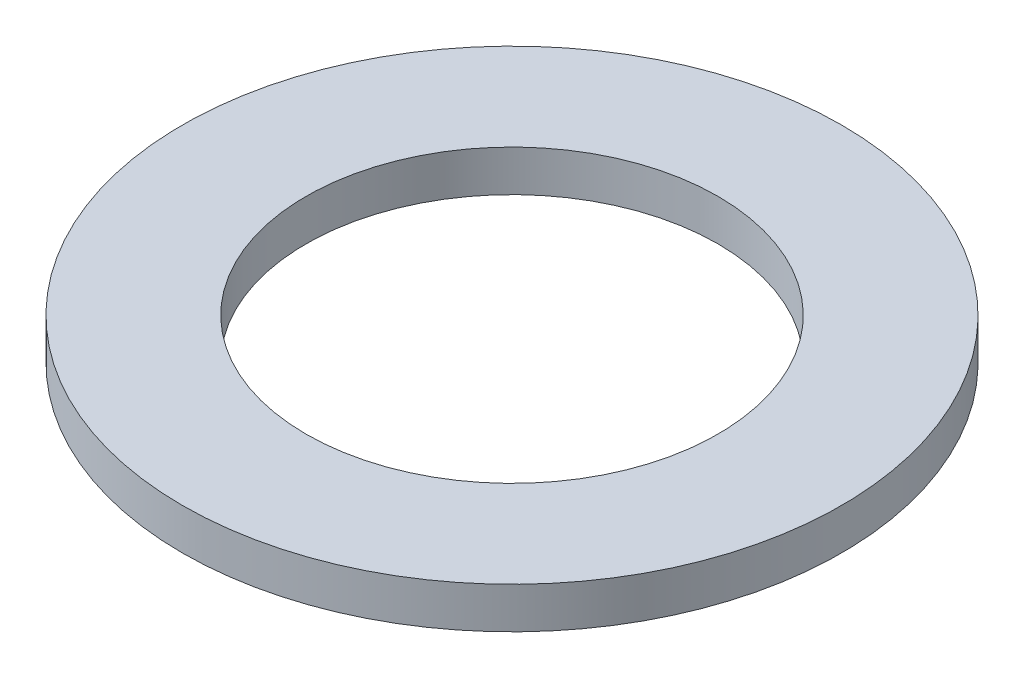
ISO-10303-21;
HEADER;
FILE_DESCRIPTION(('STEP AP214'),'2;1');
FILE_NAME('part.step','',(''),(''),'','','');
FILE_SCHEMA(('AUTOMOTIVE_DESIGN { 1 0 10303 214 1 1 1 1 }'));
ENDSEC;
DATA;
#1=APPLICATION_CONTEXT('core data for automotive mechanical design processes');
#2=APPLICATION_PROTOCOL_DEFINITION('international standard','automotive_design',2000,#1);
#3=PRODUCT_CONTEXT('',#1,'mechanical');
#4=PRODUCT('Part','Part','',(#3));
#5=PRODUCT_RELATED_PRODUCT_CATEGORY('part','',(#4));
#6=PRODUCT_DEFINITION_FORMATION('','',#4);
#7=PRODUCT_DEFINITION_CONTEXT('part definition',#1,'design');
#8=PRODUCT_DEFINITION('design','',#6,#7);
#9=PRODUCT_DEFINITION_SHAPE('','',#8);
#10=(LENGTH_UNIT() NAMED_UNIT(*) SI_UNIT(.MILLI.,.METRE.));
#11=(NAMED_UNIT(*) PLANE_ANGLE_UNIT() SI_UNIT($,.RADIAN.));
#12=(NAMED_UNIT(*) SI_UNIT($,.STERADIAN.) SOLID_ANGLE_UNIT());
#13=UNCERTAINTY_MEASURE_WITH_UNIT(LENGTH_MEASURE(1.E-05),#10,'distance_accuracy_value','');
#14=(GEOMETRIC_REPRESENTATION_CONTEXT(3) GLOBAL_UNCERTAINTY_ASSIGNED_CONTEXT((#13)) GLOBAL_UNIT_ASSIGNED_CONTEXT((#10,
#11,#12)) REPRESENTATION_CONTEXT('',''));
#15=CARTESIAN_POINT('',(0.,0.,0.));
#16=DIRECTION('',(0.,0.,1.));
#17=DIRECTION('',(1.,0.,0.));
#18=AXIS2_PLACEMENT_3D('',#15,#16,#17);
#19=CARTESIAN_POINT('',(0.,1.,0.));
#20=DIRECTION('',(0.,1.,0.));
#21=DIRECTION('',(0.,0.,1.));
#22=AXIS2_PLACEMENT_3D('',#19,#20,#21);
#23=PLANE('',#22);
#24=CARTESIAN_POINT('',(0.,1.,0.));
#25=DIRECTION('',(0.,1.,0.));
#26=DIRECTION('',(0.,0.,1.));
#27=AXIS2_PLACEMENT_3D('',#24,#25,#26);
#28=CIRCLE('',#27,8.);
#29=CARTESIAN_POINT('',(0.,1.,8.));
#30=VERTEX_POINT('',#29);
#31=EDGE_CURVE('E10',#30,#30,#28,.T.);
#32=ORIENTED_EDGE('',*,*,#31,.T.);
#33=EDGE_LOOP('',(#32));
#34=FACE_BOUND('',#33,.T.);
#35=CARTESIAN_POINT('',(0.,1.,0.));
#36=DIRECTION('',(0.,1.,0.));
#37=DIRECTION('',(0.,0.,1.));
#38=AXIS2_PLACEMENT_3D('',#35,#36,#37);
#39=CIRCLE('',#38,5.);
#40=CARTESIAN_POINT('',(0.,1.,5.));
#41=VERTEX_POINT('',#40);
#42=EDGE_CURVE('E50',#41,#41,#39,.T.);
#43=ORIENTED_EDGE('',*,*,#42,.F.);
#44=EDGE_LOOP('',(#43));
#45=FACE_BOUND('',#44,.T.);
#46=ADVANCED_FACE('F37',(#34,#45),#23,.T.);
#47=CARTESIAN_POINT('',(0.,0.,0.));
#48=DIRECTION('',(0.,1.,0.));
#49=DIRECTION('',(0.,0.,1.));
#50=AXIS2_PLACEMENT_3D('',#47,#48,#49);
#51=PLANE('',#50);
#52=CARTESIAN_POINT('',(0.,0.,0.));
#53=DIRECTION('',(0.,1.,0.));
#54=DIRECTION('',(0.,0.,1.));
#55=AXIS2_PLACEMENT_3D('',#52,#53,#54);
#56=CIRCLE('',#55,8.);
#57=CARTESIAN_POINT('',(0.,0.,8.));
#58=VERTEX_POINT('',#57);
#59=EDGE_CURVE('E41',#58,#58,#56,.T.);
#60=ORIENTED_EDGE('',*,*,#59,.F.);
#61=EDGE_LOOP('',(#60));
#62=FACE_BOUND('',#61,.T.);
#63=CARTESIAN_POINT('',(0.,0.,0.));
#64=DIRECTION('',(0.,1.,0.));
#65=DIRECTION('',(0.,0.,1.));
#66=AXIS2_PLACEMENT_3D('',#63,#64,#65);
#67=CIRCLE('',#66,5.);
#68=CARTESIAN_POINT('',(0.,0.,5.));
#69=VERTEX_POINT('',#68);
#70=EDGE_CURVE('E52',#69,#69,#67,.T.);
#71=ORIENTED_EDGE('',*,*,#70,.T.);
#72=EDGE_LOOP('',(#71));
#73=FACE_BOUND('',#72,.T.);
#74=ADVANCED_FACE('F64',(#62,#73),#51,.F.);
#75=CARTESIAN_POINT('',(0.,1.,0.));
#76=DIRECTION('',(0.,-1.,0.));
#77=DIRECTION('',(0.,0.,-1.));
#78=AXIS2_PLACEMENT_3D('',#75,#76,#77);
#79=CYLINDRICAL_SURFACE('',#78,8.);
#80=ORIENTED_EDGE('',*,*,#31,.F.);
#81=EDGE_LOOP('',(#80));
#82=FACE_BOUND('',#81,.T.);
#83=ORIENTED_EDGE('',*,*,#59,.T.);
#84=EDGE_LOOP('',(#83));
#85=FACE_BOUND('',#84,.T.);
#86=ADVANCED_FACE('F39',(#82,#85),#79,.T.);
#87=CARTESIAN_POINT('',(0.,1.,0.));
#88=DIRECTION('',(0.,-1.,0.));
#89=DIRECTION('',(0.,0.,-1.));
#90=AXIS2_PLACEMENT_3D('',#87,#88,#89);
#91=CYLINDRICAL_SURFACE('',#90,5.);
#92=ORIENTED_EDGE('',*,*,#42,.T.);
#93=EDGE_LOOP('',(#92));
#94=FACE_BOUND('',#93,.T.);
#95=ORIENTED_EDGE('',*,*,#70,.F.);
#96=EDGE_LOOP('',(#95));
#97=FACE_BOUND('',#96,.T.);
#98=ADVANCED_FACE('F60',(#94,#97),#91,.F.);
#99=CLOSED_SHELL('',(#46,#74,#86,#98));
#100=MANIFOLD_SOLID_BREP('B2',#99);
#101=ADVANCED_BREP_SHAPE_REPRESENTATION('',(#18,#100),#14);
#102=SHAPE_DEFINITION_REPRESENTATION(#9,#101);
ENDSEC;
END-ISO-10303-21;
